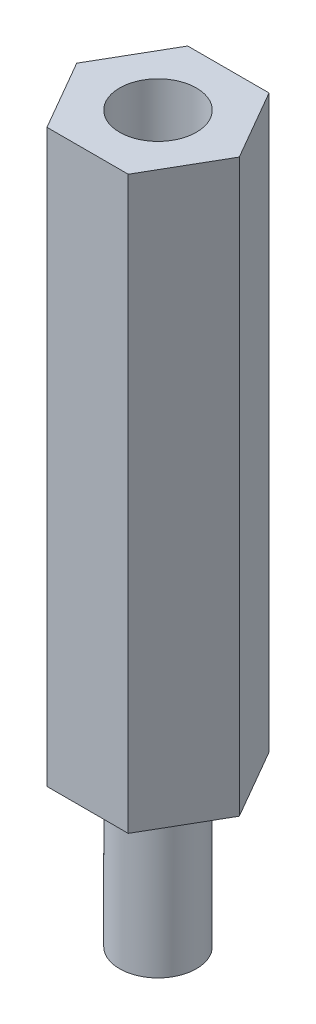
ISO-10303-21;
HEADER;
FILE_DESCRIPTION(('STEP AP214'),'2;1');
FILE_NAME('part.step','',(''),(''),'','','');
FILE_SCHEMA(('AUTOMOTIVE_DESIGN { 1 0 10303 214 1 1 1 1 }'));
ENDSEC;
DATA;
#1=APPLICATION_CONTEXT('core data for automotive mechanical design processes');
#2=APPLICATION_PROTOCOL_DEFINITION('international standard','automotive_design',2000,#1);
#3=PRODUCT_CONTEXT('',#1,'mechanical');
#4=PRODUCT('Part','Part','',(#3));
#5=PRODUCT_RELATED_PRODUCT_CATEGORY('part','',(#4));
#6=PRODUCT_DEFINITION_FORMATION('','',#4);
#7=PRODUCT_DEFINITION_CONTEXT('part definition',#1,'design');
#8=PRODUCT_DEFINITION('design','',#6,#7);
#9=PRODUCT_DEFINITION_SHAPE('','',#8);
#10=(LENGTH_UNIT() NAMED_UNIT(*) SI_UNIT(.MILLI.,.METRE.));
#11=(NAMED_UNIT(*) PLANE_ANGLE_UNIT() SI_UNIT($,.RADIAN.));
#12=(NAMED_UNIT(*) SI_UNIT($,.STERADIAN.) SOLID_ANGLE_UNIT());
#13=UNCERTAINTY_MEASURE_WITH_UNIT(LENGTH_MEASURE(1.E-05),#10,'distance_accuracy_value','');
#14=(GEOMETRIC_REPRESENTATION_CONTEXT(3) GLOBAL_UNCERTAINTY_ASSIGNED_CONTEXT((#13)) GLOBAL_UNIT_ASSIGNED_CONTEXT((#10,
#11,#12)) REPRESENTATION_CONTEXT('',''));
#15=CARTESIAN_POINT('',(0.,0.,0.));
#16=DIRECTION('',(0.,0.,1.));
#17=DIRECTION('',(1.,0.,0.));
#18=AXIS2_PLACEMENT_3D('',#15,#16,#17);
#19=CARTESIAN_POINT('',(0.,22.3,0.));
#20=DIRECTION('',(0.,-1.,0.));
#21=DIRECTION('',(0.,0.,-1.));
#22=AXIS2_PLACEMENT_3D('',#19,#20,#21);
#23=CYLINDRICAL_SURFACE('',#22,1.5);
#24=CARTESIAN_POINT('',(0.,22.3,0.));
#25=DIRECTION('',(0.,1.,0.));
#26=DIRECTION('',(0.,0.,1.));
#27=AXIS2_PLACEMENT_3D('',#24,#25,#26);
#28=CIRCLE('',#27,1.5);
#29=CARTESIAN_POINT('',(0.,22.3,1.5));
#30=VERTEX_POINT('',#29);
#31=EDGE_CURVE('E123',#30,#30,#28,.T.);
#32=ORIENTED_EDGE('',*,*,#31,.T.);
#33=EDGE_LOOP('',(#32));
#34=FACE_BOUND('',#33,.T.);
#35=CARTESIAN_POINT('',(0.,1.,0.));
#36=DIRECTION('',(0.,-1.,0.));
#37=DIRECTION('',(0.,0.,-1.));
#38=AXIS2_PLACEMENT_3D('',#35,#36,#37);
#39=CIRCLE('',#38,1.5);
#40=CARTESIAN_POINT('',(0.,1.,-1.5));
#41=VERTEX_POINT('',#40);
#42=EDGE_CURVE('E228',#41,#41,#39,.T.);
#43=ORIENTED_EDGE('',*,*,#42,.T.);
#44=EDGE_LOOP('',(#43));
#45=FACE_BOUND('',#44,.T.);
#46=ADVANCED_FACE('F33',(#34,#45),#23,.F.);
#47=CARTESIAN_POINT('',(0.,22.3,0.));
#48=DIRECTION('',(0.,1.,0.));
#49=DIRECTION('',(0.,0.,1.));
#50=AXIS2_PLACEMENT_3D('',#47,#48,#49);
#51=PLANE('',#50);
#52=DIRECTION('',(-0.5,0.,-0.866025403784438));
#53=VECTOR('',#52,1.);
#54=CARTESIAN_POINT('',(3.17542648054294,22.3,0.));
#55=LINE('',#54,#53);
#56=CARTESIAN_POINT('',(3.17542648054294,22.3,0.));
#57=VERTEX_POINT('',#56);
#58=CARTESIAN_POINT('',(1.58771324027147,22.3,-2.75));
#59=VERTEX_POINT('',#58);
#60=EDGE_CURVE('E130',#57,#59,#55,.T.);
#61=ORIENTED_EDGE('',*,*,#60,.T.);
#62=DIRECTION('',(-1.,0.,0.));
#63=VECTOR('',#62,1.);
#64=CARTESIAN_POINT('',(1.58771324027147,22.3,-2.75));
#65=LINE('',#64,#63);
#66=CARTESIAN_POINT('',(-1.58771324027147,22.3,-2.75));
#67=VERTEX_POINT('',#66);
#68=EDGE_CURVE('E87',#59,#67,#65,.T.);
#69=ORIENTED_EDGE('',*,*,#68,.T.);
#70=DIRECTION('',(-0.5,0.,0.866025403784439));
#71=VECTOR('',#70,1.);
#72=CARTESIAN_POINT('',(-1.58771324027147,22.3,-2.75));
#73=LINE('',#72,#71);
#74=CARTESIAN_POINT('',(-3.17542648054294,22.3,0.));
#75=VERTEX_POINT('',#74);
#76=EDGE_CURVE('E101',#67,#75,#73,.T.);
#77=ORIENTED_EDGE('',*,*,#76,.T.);
#78=DIRECTION('',(0.5,0.,0.866025403784439));
#79=VECTOR('',#78,1.);
#80=CARTESIAN_POINT('',(-3.17542648054294,22.3,0.));
#81=LINE('',#80,#79);
#82=CARTESIAN_POINT('',(-1.58771324027147,22.3,2.75));
#83=VERTEX_POINT('',#82);
#84=EDGE_CURVE('E94',#75,#83,#81,.T.);
#85=ORIENTED_EDGE('',*,*,#84,.T.);
#86=DIRECTION('',(1.,0.,0.));
#87=VECTOR('',#86,1.);
#88=CARTESIAN_POINT('',(-1.58771324027147,22.3,2.75));
#89=LINE('',#88,#87);
#90=CARTESIAN_POINT('',(1.58771324027147,22.3,2.75));
#91=VERTEX_POINT('',#90);
#92=EDGE_CURVE('E99',#83,#91,#89,.T.);
#93=ORIENTED_EDGE('',*,*,#92,.T.);
#94=DIRECTION('',(0.5,0.,-0.866025403784439));
#95=VECTOR('',#94,1.);
#96=CARTESIAN_POINT('',(1.58771324027147,22.3,2.75));
#97=LINE('',#96,#95);
#98=EDGE_CURVE('E50',#91,#57,#97,.T.);
#99=ORIENTED_EDGE('',*,*,#98,.T.);
#100=EDGE_LOOP('',(#61,#69,#77,#85,#93,#99));
#101=FACE_BOUND('',#100,.T.);
#102=ORIENTED_EDGE('',*,*,#31,.F.);
#103=EDGE_LOOP('',(#102));
#104=FACE_BOUND('',#103,.T.);
#105=ADVANCED_FACE('F96',(#101,#104),#51,.T.);
#106=CARTESIAN_POINT('',(0.,0.,0.));
#107=DIRECTION('',(0.,1.,0.));
#108=DIRECTION('',(0.,0.,1.));
#109=AXIS2_PLACEMENT_3D('',#106,#107,#108);
#110=PLANE('',#109);
#111=DIRECTION('',(-0.5,0.,-0.866025403784438));
#112=VECTOR('',#111,1.);
#113=CARTESIAN_POINT('',(3.17542648054294,0.,0.));
#114=LINE('',#113,#112);
#115=CARTESIAN_POINT('',(3.17542648054294,0.,0.));
#116=VERTEX_POINT('',#115);
#117=CARTESIAN_POINT('',(1.58771324027147,0.,-2.75));
#118=VERTEX_POINT('',#117);
#119=EDGE_CURVE('E119',#116,#118,#114,.T.);
#120=ORIENTED_EDGE('',*,*,#119,.F.);
#121=DIRECTION('',(0.5,0.,-0.866025403784439));
#122=VECTOR('',#121,1.);
#123=CARTESIAN_POINT('',(1.58771324027147,0.,2.75));
#124=LINE('',#123,#122);
#125=CARTESIAN_POINT('',(1.58771324027147,0.,2.75));
#126=VERTEX_POINT('',#125);
#127=EDGE_CURVE('E79',#126,#116,#124,.T.);
#128=ORIENTED_EDGE('',*,*,#127,.F.);
#129=DIRECTION('',(1.,0.,0.));
#130=VECTOR('',#129,1.);
#131=CARTESIAN_POINT('',(-1.58771324027147,0.,2.75));
#132=LINE('',#131,#130);
#133=CARTESIAN_POINT('',(-1.58771324027147,0.,2.75));
#134=VERTEX_POINT('',#133);
#135=EDGE_CURVE('E73',#134,#126,#132,.T.);
#136=ORIENTED_EDGE('',*,*,#135,.F.);
#137=DIRECTION('',(0.5,0.,0.866025403784439));
#138=VECTOR('',#137,1.);
#139=CARTESIAN_POINT('',(-3.17542648054294,0.,0.));
#140=LINE('',#139,#138);
#141=CARTESIAN_POINT('',(-3.17542648054294,0.,0.));
#142=VERTEX_POINT('',#141);
#143=EDGE_CURVE('E109',#142,#134,#140,.T.);
#144=ORIENTED_EDGE('',*,*,#143,.F.);
#145=DIRECTION('',(-0.5,0.,0.866025403784439));
#146=VECTOR('',#145,1.);
#147=CARTESIAN_POINT('',(-1.58771324027147,0.,-2.75));
#148=LINE('',#147,#146);
#149=CARTESIAN_POINT('',(-1.58771324027147,0.,-2.75));
#150=VERTEX_POINT('',#149);
#151=EDGE_CURVE('E125',#150,#142,#148,.T.);
#152=ORIENTED_EDGE('',*,*,#151,.F.);
#153=DIRECTION('',(-1.,0.,0.));
#154=VECTOR('',#153,1.);
#155=CARTESIAN_POINT('',(1.58771324027147,0.,-2.75));
#156=LINE('',#155,#154);
#157=EDGE_CURVE('E122',#118,#150,#156,.T.);
#158=ORIENTED_EDGE('',*,*,#157,.F.);
#159=EDGE_LOOP('',(#120,#128,#136,#144,#152,#158));
#160=FACE_BOUND('',#159,.T.);
#161=CARTESIAN_POINT('',(0.,0.,0.));
#162=DIRECTION('',(0.,1.,0.));
#163=DIRECTION('',(0.,0.,1.));
#164=AXIS2_PLACEMENT_3D('',#161,#162,#163);
#165=CIRCLE('',#164,1.5);
#166=CARTESIAN_POINT('',(0.,0.,1.5));
#167=VERTEX_POINT('',#166);
#168=EDGE_CURVE('E231',#167,#167,#165,.T.);
#169=ORIENTED_EDGE('',*,*,#168,.T.);
#170=EDGE_LOOP('',(#169));
#171=FACE_BOUND('',#170,.T.);
#172=ADVANCED_FACE('F139',(#160,#171),#110,.F.);
#173=CARTESIAN_POINT('',(3.17542648054294,22.3,0.));
#174=DIRECTION('',(-0.866025403784439,0.,0.5));
#175=DIRECTION('',(0.5,0.,0.866025403784439));
#176=AXIS2_PLACEMENT_3D('',#173,#174,#175);
#177=PLANE('',#176);
#178=ORIENTED_EDGE('',*,*,#119,.T.);
#179=DIRECTION('',(0.,-1.,0.));
#180=VECTOR('',#179,1.);
#181=CARTESIAN_POINT('',(1.58771324027147,22.3,-2.75));
#182=LINE('',#181,#180);
#183=EDGE_CURVE('E11',#59,#118,#182,.T.);
#184=ORIENTED_EDGE('',*,*,#183,.F.);
#185=ORIENTED_EDGE('',*,*,#60,.F.);
#186=DIRECTION('',(0.,-1.,0.));
#187=VECTOR('',#186,1.);
#188=CARTESIAN_POINT('',(3.17542648054294,22.3,0.));
#189=LINE('',#188,#187);
#190=EDGE_CURVE('E115',#57,#116,#189,.T.);
#191=ORIENTED_EDGE('',*,*,#190,.T.);
#192=EDGE_LOOP('',(#178,#184,#185,#191));
#193=FACE_BOUND('',#192,.T.);
#194=ADVANCED_FACE('F35',(#193),#177,.F.);
#195=CARTESIAN_POINT('',(1.58771324027147,22.3,-2.75));
#196=DIRECTION('',(0.,0.,1.));
#197=DIRECTION('',(1.,0.,0.));
#198=AXIS2_PLACEMENT_3D('',#195,#196,#197);
#199=PLANE('',#198);
#200=ORIENTED_EDGE('',*,*,#157,.T.);
#201=DIRECTION('',(0.,-1.,0.));
#202=VECTOR('',#201,1.);
#203=CARTESIAN_POINT('',(-1.58771324027147,22.3,-2.75));
#204=LINE('',#203,#202);
#205=EDGE_CURVE('E42',#67,#150,#204,.T.);
#206=ORIENTED_EDGE('',*,*,#205,.F.);
#207=ORIENTED_EDGE('',*,*,#68,.F.);
#208=ORIENTED_EDGE('',*,*,#183,.T.);
#209=EDGE_LOOP('',(#200,#206,#207,#208));
#210=FACE_BOUND('',#209,.T.);
#211=ADVANCED_FACE('F171',(#210),#199,.F.);
#212=CARTESIAN_POINT('',(-1.58771324027147,22.3,-2.75));
#213=DIRECTION('',(0.866025403784439,0.,0.5));
#214=DIRECTION('',(0.5,0.,-0.866025403784439));
#215=AXIS2_PLACEMENT_3D('',#212,#213,#214);
#216=PLANE('',#215);
#217=ORIENTED_EDGE('',*,*,#151,.T.);
#218=DIRECTION('',(0.,-1.,0.));
#219=VECTOR('',#218,1.);
#220=CARTESIAN_POINT('',(-3.17542648054294,22.3,0.));
#221=LINE('',#220,#219);
#222=EDGE_CURVE('E110',#75,#142,#221,.T.);
#223=ORIENTED_EDGE('',*,*,#222,.F.);
#224=ORIENTED_EDGE('',*,*,#76,.F.);
#225=ORIENTED_EDGE('',*,*,#205,.T.);
#226=EDGE_LOOP('',(#217,#223,#224,#225));
#227=FACE_BOUND('',#226,.T.);
#228=ADVANCED_FACE('F136',(#227),#216,.F.);
#229=CARTESIAN_POINT('',(-3.17542648054294,22.3,0.));
#230=DIRECTION('',(0.866025403784438,0.,-0.5));
#231=DIRECTION('',(-0.5,0.,-0.866025403784439));
#232=AXIS2_PLACEMENT_3D('',#229,#230,#231);
#233=PLANE('',#232);
#234=ORIENTED_EDGE('',*,*,#143,.T.);
#235=DIRECTION('',(0.,-1.,0.));
#236=VECTOR('',#235,1.);
#237=CARTESIAN_POINT('',(-1.58771324027147,22.3,2.75));
#238=LINE('',#237,#236);
#239=EDGE_CURVE('E106',#83,#134,#238,.T.);
#240=ORIENTED_EDGE('',*,*,#239,.F.);
#241=ORIENTED_EDGE('',*,*,#84,.F.);
#242=ORIENTED_EDGE('',*,*,#222,.T.);
#243=EDGE_LOOP('',(#234,#240,#241,#242));
#244=FACE_BOUND('',#243,.T.);
#245=ADVANCED_FACE('F107',(#244),#233,.F.);
#246=CARTESIAN_POINT('',(-1.58771324027147,22.3,2.75));
#247=DIRECTION('',(0.,0.,-1.));
#248=DIRECTION('',(-1.,0.,0.));
#249=AXIS2_PLACEMENT_3D('',#246,#247,#248);
#250=PLANE('',#249);
#251=ORIENTED_EDGE('',*,*,#135,.T.);
#252=DIRECTION('',(0.,-1.,0.));
#253=VECTOR('',#252,1.);
#254=CARTESIAN_POINT('',(1.58771324027147,22.3,2.75));
#255=LINE('',#254,#253);
#256=EDGE_CURVE('E111',#91,#126,#255,.T.);
#257=ORIENTED_EDGE('',*,*,#256,.F.);
#258=ORIENTED_EDGE('',*,*,#92,.F.);
#259=ORIENTED_EDGE('',*,*,#239,.T.);
#260=EDGE_LOOP('',(#251,#257,#258,#259));
#261=FACE_BOUND('',#260,.T.);
#262=ADVANCED_FACE('F113',(#261),#250,.F.);
#263=CARTESIAN_POINT('',(1.58771324027147,22.3,2.75));
#264=DIRECTION('',(-0.866025403784439,0.,-0.5));
#265=DIRECTION('',(-0.5,0.,0.866025403784439));
#266=AXIS2_PLACEMENT_3D('',#263,#264,#265);
#267=PLANE('',#266);
#268=ORIENTED_EDGE('',*,*,#127,.T.);
#269=ORIENTED_EDGE('',*,*,#190,.F.);
#270=ORIENTED_EDGE('',*,*,#98,.F.);
#271=ORIENTED_EDGE('',*,*,#256,.T.);
#272=EDGE_LOOP('',(#268,#269,#270,#271));
#273=FACE_BOUND('',#272,.T.);
#274=ADVANCED_FACE('F144',(#273),#267,.F.);
#275=CARTESIAN_POINT('',(0.,1.,0.));
#276=DIRECTION('',(0.,-1.,0.));
#277=DIRECTION('',(0.,0.,-1.));
#278=AXIS2_PLACEMENT_3D('',#275,#276,#277);
#279=PLANE('',#278);
#280=ORIENTED_EDGE('',*,*,#42,.F.);
#281=EDGE_LOOP('',(#280));
#282=FACE_BOUND('',#281,.T.);
#283=ADVANCED_FACE('F146',(#282),#279,.F.);
#284=CARTESIAN_POINT('',(0.,1.,0.));
#285=DIRECTION('',(0.,-1.,0.));
#286=DIRECTION('',(0.,0.,-1.));
#287=AXIS2_PLACEMENT_3D('',#284,#285,#286);
#288=CYLINDRICAL_SURFACE('',#287,1.5);
#289=CARTESIAN_POINT('',(0.,-6.,0.));
#290=DIRECTION('',(0.,-1.,0.));
#291=DIRECTION('',(0.,0.,-1.));
#292=AXIS2_PLACEMENT_3D('',#289,#290,#291);
#293=CIRCLE('',#292,1.5);
#294=CARTESIAN_POINT('',(0.,-6.,-1.5));
#295=VERTEX_POINT('',#294);
#296=EDGE_CURVE('E227',#295,#295,#293,.T.);
#297=ORIENTED_EDGE('',*,*,#296,.F.);
#298=EDGE_LOOP('',(#297));
#299=FACE_BOUND('',#298,.T.);
#300=ORIENTED_EDGE('',*,*,#168,.F.);
#301=EDGE_LOOP('',(#300));
#302=FACE_BOUND('',#301,.T.);
#303=ADVANCED_FACE('F152',(#299,#302),#288,.T.);
#304=CARTESIAN_POINT('',(0.,-6.,0.));
#305=DIRECTION('',(0.,-1.,0.));
#306=DIRECTION('',(0.,0.,-1.));
#307=AXIS2_PLACEMENT_3D('',#304,#305,#306);
#308=PLANE('',#307);
#309=ORIENTED_EDGE('',*,*,#296,.T.);
#310=EDGE_LOOP('',(#309));
#311=FACE_BOUND('',#310,.T.);
#312=ADVANCED_FACE('F212',(#311),#308,.T.);
#313=CLOSED_SHELL('',(#46,#105,#172,#194,#211,#228,#245,#262,#274,#283,#303,#312));
#314=MANIFOLD_SOLID_BREP('B2',#313);
#315=ADVANCED_BREP_SHAPE_REPRESENTATION('',(#18,#314),#14);
#316=SHAPE_DEFINITION_REPRESENTATION(#9,#315);
ENDSEC;
END-ISO-10303-21;
